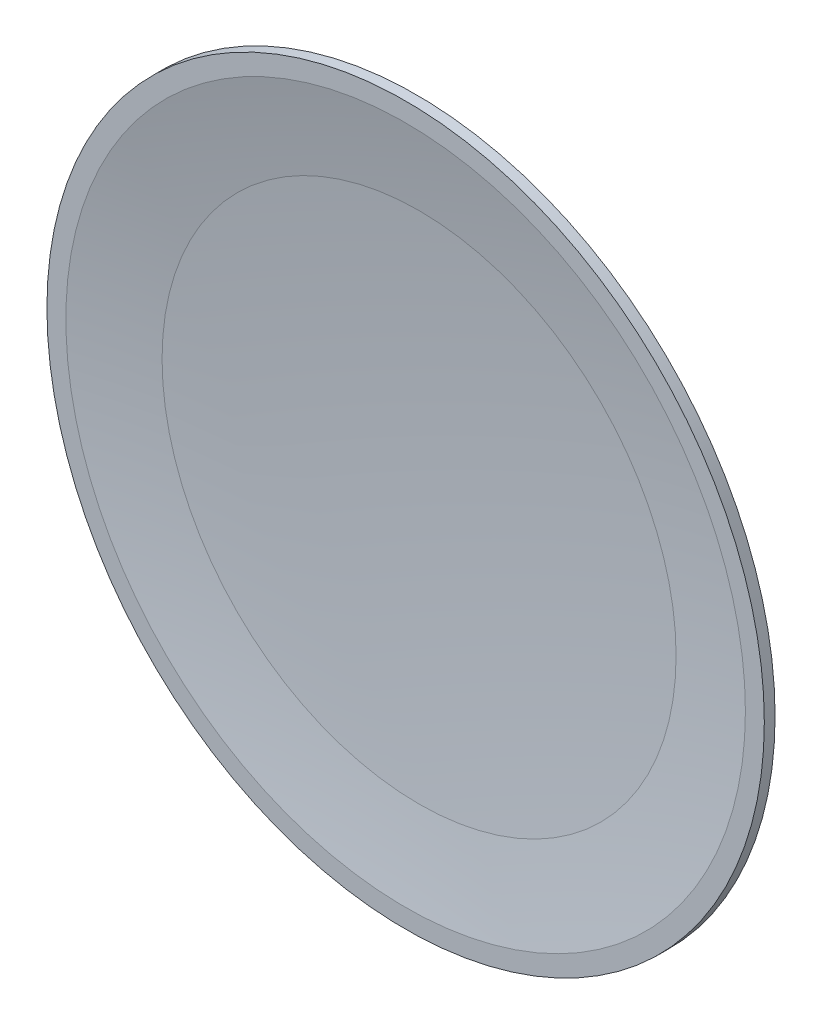
ISO-10303-21;
HEADER;
FILE_DESCRIPTION(('STEP AP214'),'2;1');
FILE_NAME('part.step','',(''),(''),'','','');
FILE_SCHEMA(('AUTOMOTIVE_DESIGN { 1 0 10303 214 1 1 1 1 }'));
ENDSEC;
DATA;
#1=APPLICATION_CONTEXT('core data for automotive mechanical design processes');
#2=APPLICATION_PROTOCOL_DEFINITION('international standard','automotive_design',2000,#1);
#3=PRODUCT_CONTEXT('',#1,'mechanical');
#4=PRODUCT('Part','Part','',(#3));
#5=PRODUCT_RELATED_PRODUCT_CATEGORY('part','',(#4));
#6=PRODUCT_DEFINITION_FORMATION('','',#4);
#7=PRODUCT_DEFINITION_CONTEXT('part definition',#1,'design');
#8=PRODUCT_DEFINITION('design','',#6,#7);
#9=PRODUCT_DEFINITION_SHAPE('','',#8);
#10=(LENGTH_UNIT() NAMED_UNIT(*) SI_UNIT(.MILLI.,.METRE.));
#11=(NAMED_UNIT(*) PLANE_ANGLE_UNIT() SI_UNIT($,.RADIAN.));
#12=(NAMED_UNIT(*) SI_UNIT($,.STERADIAN.) SOLID_ANGLE_UNIT());
#13=UNCERTAINTY_MEASURE_WITH_UNIT(LENGTH_MEASURE(1.E-05),#10,'distance_accuracy_value','');
#14=(GEOMETRIC_REPRESENTATION_CONTEXT(3) GLOBAL_UNCERTAINTY_ASSIGNED_CONTEXT((#13)) GLOBAL_UNIT_ASSIGNED_CONTEXT((#10,
#11,#12)) REPRESENTATION_CONTEXT('',''));
#15=CARTESIAN_POINT('',(0.,0.,0.));
#16=DIRECTION('',(0.,0.,1.));
#17=DIRECTION('',(1.,0.,0.));
#18=AXIS2_PLACEMENT_3D('',#15,#16,#17);
#19=CARTESIAN_POINT('',(0.,0.,0.));
#20=DIRECTION('',(0.,0.,-1.));
#21=DIRECTION('',(1.,0.,0.));
#22=AXIS2_PLACEMENT_3D('',#19,#20,#21);
#23=SPHERICAL_SURFACE('',#22,38.);
#24=CARTESIAN_POINT('',(0.,0.,-37.829089336118));
#25=DIRECTION('',(0.,0.,-1.));
#26=DIRECTION('',(-1.,0.,0.));
#27=AXIS2_PLACEMENT_3D('',#24,#25,#26);
#28=CIRCLE('',#27,3.6);
#29=CARTESIAN_POINT('',(3.60000000000005,0.,-37.829089336118));
#30=VERTEX_POINT('',#29);
#31=EDGE_CURVE('E10',#30,#30,#28,.T.);
#32=ORIENTED_EDGE('',*,*,#31,.T.);
#33=EDGE_LOOP('',(#32));
#34=FACE_BOUND('',#33,.T.);
#35=ADVANCED_FACE('F27',(#34),#23,.T.);
#36=CARTESIAN_POINT('',(0.,0.,-12.));
#37=DIRECTION('',(0.,0.,-1.));
#38=DIRECTION('',(1.,0.,0.));
#39=AXIS2_PLACEMENT_3D('',#36,#37,#38);
#40=SPHERICAL_SURFACE('',#39,26.0787625460482);
#41=CARTESIAN_POINT('',(0.,0.,-37.6425302170665));
#42=DIRECTION('',(0.,0.,-1.));
#43=DIRECTION('',(-1.,0.,0.));
#44=AXIS2_PLACEMENT_3D('',#41,#42,#43);
#45=CIRCLE('',#44,4.75);
#46=CARTESIAN_POINT('',(4.75000000000004,0.,-37.6425302170665));
#47=VERTEX_POINT('',#46);
#48=EDGE_CURVE('E33',#47,#47,#45,.T.);
#49=CARTESIAN_POINT('',(3.60000000000005,0.,-37.829089336118));
#50=CARTESIAN_POINT('',(3.61202058531943,0.,-37.8274139341543));
#51=CARTESIAN_POINT('',(3.62404000106563,0.,-37.8257301407989));
#52=CARTESIAN_POINT('',(3.64807646998601,0.,-37.8223457746128));
#53=CARTESIAN_POINT('',(3.66009352316019,0.,-37.820645201782));
#54=CARTESIAN_POINT('',(3.68412524351089,0.,-37.8172272799532));
#55=CARTESIAN_POINT('',(3.69613991068741,0.,-37.8155099309551));
#56=CARTESIAN_POINT('',(3.72016683562303,0.,-37.812058460141));
#57=CARTESIAN_POINT('',(3.73217909338213,0.,-37.810324338325));
#58=CARTESIAN_POINT('',(3.75620117606751,0.,-37.8068393252549));
#59=CARTESIAN_POINT('',(3.7682110009938,0.,-37.8050884340008));
#60=CARTESIAN_POINT('',(3.79222819460301,0.,-37.8015698854676));
#61=CARTESIAN_POINT('',(3.80423556328593,0.,-37.7998022281885));
#62=CARTESIAN_POINT('',(3.82824782100259,0.,-37.796250151051));
#63=CARTESIAN_POINT('',(3.84025271003634,0.,-37.7944657311926));
#64=CARTESIAN_POINT('',(3.86425998505372,0.,-37.7908801323748));
#65=CARTESIAN_POINT('',(3.87626237103734,0.,-37.7890789534153));
#66=CARTESIAN_POINT('',(3.90026461655839,0.,-37.7854598399065));
#67=CARTESIAN_POINT('',(3.91226447609581,0.,-37.7836419053571));
#68=CARTESIAN_POINT('',(3.9362616453333,0.,-37.779989284212));
#69=CARTESIAN_POINT('',(3.94825895503337,0.,-37.7781545976163));
#70=CARTESIAN_POINT('',(3.97225100120996,0.,-37.774468475955));
#71=CARTESIAN_POINT('',(3.98424573768649,0.,-37.7726170408893));
#72=CARTESIAN_POINT('',(4.00823261403484,0.,-37.7688974258969));
#73=CARTESIAN_POINT('',(4.02022475390666,0.,-37.7670292459702));
#74=CARTESIAN_POINT('',(4.04420641366949,0.,-37.7632761448975));
#75=CARTESIAN_POINT('',(4.0561959335605,0.,-37.7613912237514));
#76=CARTESIAN_POINT('',(4.0801723299907,0.,-37.7576046439142));
#77=CARTESIAN_POINT('',(4.0921592065299,0.,-37.755702985223));
#78=CARTESIAN_POINT('',(4.11613029289063,0.,-37.7518829340023));
#79=CARTESIAN_POINT('',(4.12811450271217,0.,-37.7499645414728));
#80=CARTESIAN_POINT('',(4.15208023227695,0.,-37.7461110263151));
#81=CARTESIAN_POINT('',(4.16406175202018,0.,-37.7441759036869));
#82=CARTESIAN_POINT('',(4.18802207807293,0.,-37.7402889321038));
#83=CARTESIAN_POINT('',(4.20000088438245,0.,-37.7383370831489));
#84=CARTESIAN_POINT('',(4.22395576021767,0.,-37.7344166627172));
#85=CARTESIAN_POINT('',(4.23593182974337,0.,-37.7324480912403));
#86=CARTESIAN_POINT('',(4.25988120866616,0.,-37.728494229602));
#87=CARTESIAN_POINT('',(4.27185451806325,0.,-37.7265089394405));
#88=CARTESIAN_POINT('',(4.29579835338943,0.,-37.7225216443028));
#89=CARTESIAN_POINT('',(4.30776887931852,0.,-37.7205196393266));
#90=CARTESIAN_POINT('',(4.33170712437472,0.,-37.7164989184619));
#91=CARTESIAN_POINT('',(4.34367484350182,0.,-37.7144802025734));
#92=CARTESIAN_POINT('',(4.36760745162556,0.,-37.7104260638192));
#93=CARTESIAN_POINT('',(4.37957234062219,0.,-37.7083906409535));
#94=CARTESIAN_POINT('',(4.40349926516197,0.,-37.7043030922126));
#95=CARTESIAN_POINT('',(4.41546130070513,0.,-37.7022509663373));
#96=CARTESIAN_POINT('',(4.43938249502055,0.,-37.6981300155773));
#97=CARTESIAN_POINT('',(4.45134165379281,0.,-37.6960611906926));
#98=CARTESIAN_POINT('',(4.47525707125464,0.,-37.6919068459466));
#99=CARTESIAN_POINT('',(4.48721332994419,0.,-37.6898213260852));
#100=CARTESIAN_POINT('',(4.51112292393444,0.,-37.6856335954511));
#101=CARTESIAN_POINT('',(4.52307625923512,0.,-37.6835313846783));
#102=CARTESIAN_POINT('',(4.54697998314715,0.,-37.6793102763191));
#103=CARTESIAN_POINT('',(4.5589303717585,0.,-37.6771913787328));
#104=CARTESIAN_POINT('',(4.58282817899714,0.,-37.6729369008768));
#105=CARTESIAN_POINT('',(4.59477559762444,0.,-37.6708013206072));
#106=CARTESIAN_POINT('',(4.61866744160602,0.,-37.6665134815475));
#107=CARTESIAN_POINT('',(4.63061186696031,0.,-37.6643612227573));
#108=CARTESIAN_POINT('',(4.65449770111287,0.,-37.6600400308525));
#109=CARTESIAN_POINT('',(4.66643910991114,0.,-37.6578710977377));
#110=CARTESIAN_POINT('',(4.69031888767412,0.,-37.6535165614096));
#111=CARTESIAN_POINT('',(4.70225725663883,0.,-37.6513309581962));
#112=CARTESIAN_POINT('',(4.72613093146464,0.,-37.6469430859381));
#113=CARTESIAN_POINT('',(4.73806623732575,0.,-37.6447408168933));
#114=CARTESIAN_POINT('',(4.75000000000004,0.,-37.6425302170665));
#115=B_SPLINE_CURVE_WITH_KNOTS('',3,(#49,#50,#51,#52,#53,#54,#55,#56,#57,#58,#59,#60,#61,#62,
#63,#64,#65,#66,#67,#68,#69,#70,#71,#72,#73,#74,#75,#76,#77,#78,#79,#80,#81,#82,#83,#84,#85,#86,
#87,#88,#89,#90,#91,#92,#93,#94,#95,#96,#97,#98,#99,#100,#101,#102,#103,#104,#105,#106,#107,
#108,#109,#110,#111,#112,#113,#114),.UNSPECIFIED.,.F.,.F.,(4,2,2,2,2,2,2,2,2,2,2,2,2,2,2,2,2,2,
2,2,2,2,2,2,2,2,2,2,2,2,2,2,4),(0.,0.0364103388214898,0.0728206776429851,0.109231016464475,
0.145641355285971,0.18205169410746,0.218462032928955,0.254872371750445,0.291282710571941,
0.327693049393431,0.36410338821492,0.400513727036416,0.436924065857905,0.473334404679401,
0.509744743500891,0.546155082322385,0.582565421143876,0.618975759965365,0.655386098786861,
0.691796437608351,0.728206776429847,0.764617115251334,0.801027454072832,0.83743779289432,
0.873848131715812,0.910258470537305,0.946668809358796,0.983079148180292,1.01948948700178,
1.05589982582328,1.09231016464477,1.12872050346626,1.16513084228775),.UNSPECIFIED.);
#116=EDGE_CURVE('BSEAM65',#30,#47,#115,.T.);
#117=ORIENTED_EDGE('',*,*,#31,.F.);
#118=ORIENTED_EDGE('',*,*,#48,.T.);
#119=ORIENTED_EDGE('',*,*,#116,.T.);
#120=ORIENTED_EDGE('',*,*,#116,.F.);
#121=EDGE_LOOP('',(#117,#119,#118,#120));
#122=FACE_BOUND('',#121,.T.);
#123=ADVANCED_FACE('F65',(#122),#40,.T.);
#124=CARTESIAN_POINT('',(4.75,0.,-37.6425302170665));
#125=DIRECTION('',(0.,0.,1.));
#126=DIRECTION('',(1.,0.,0.));
#127=AXIS2_PLACEMENT_3D('',#124,#125,#126);
#128=PLANE('',#127);
#129=ORIENTED_EDGE('',*,*,#48,.F.);
#130=EDGE_LOOP('',(#129));
#131=FACE_BOUND('',#130,.T.);
#132=CARTESIAN_POINT('',(0.,0.,-37.6425302170665));
#133=DIRECTION('',(0.,0.,-1.));
#134=DIRECTION('',(-1.,0.,0.));
#135=AXIS2_PLACEMENT_3D('',#132,#133,#134);
#136=CIRCLE('',#135,5.);
#137=CARTESIAN_POINT('',(-5.,0.,-37.6425302170665));
#138=VERTEX_POINT('',#137);
#139=EDGE_CURVE('E37',#138,#138,#136,.T.);
#140=ORIENTED_EDGE('',*,*,#139,.T.);
#141=EDGE_LOOP('',(#140));
#142=FACE_BOUND('',#141,.T.);
#143=ADVANCED_FACE('F69',(#131,#142),#128,.F.);
#144=CARTESIAN_POINT('',(0.,0.,-22.1284260553821));
#145=DIRECTION('',(0.,0.,-1.));
#146=DIRECTION('',(-1.,0.,0.));
#147=AXIS2_PLACEMENT_3D('',#144,#145,#146);
#148=CYLINDRICAL_SURFACE('',#147,5.);
#149=ORIENTED_EDGE('',*,*,#139,.F.);
#150=EDGE_LOOP('',(#149));
#151=FACE_BOUND('',#150,.T.);
#152=CARTESIAN_POINT('',(0.,0.,-37.4925302170665));
#153=DIRECTION('',(0.,0.,-1.));
#154=DIRECTION('',(-1.,0.,0.));
#155=AXIS2_PLACEMENT_3D('',#152,#153,#154);
#156=CIRCLE('',#155,5.);
#157=CARTESIAN_POINT('',(-5.,0.,-37.4925302170665));
#158=VERTEX_POINT('',#157);
#159=EDGE_CURVE('E41',#158,#158,#156,.T.);
#160=ORIENTED_EDGE('',*,*,#159,.T.);
#161=EDGE_LOOP('',(#160));
#162=FACE_BOUND('',#161,.T.);
#163=ADVANCED_FACE('F74',(#151,#162),#148,.T.);
#164=CARTESIAN_POINT('',(4.73620420815078,0.,-37.4925302170665));
#165=DIRECTION('',(0.,0.,-1.));
#166=DIRECTION('',(-1.,0.,0.));
#167=AXIS2_PLACEMENT_3D('',#164,#165,#166);
#168=PLANE('',#167);
#169=ORIENTED_EDGE('',*,*,#159,.F.);
#170=EDGE_LOOP('',(#169));
#171=FACE_BOUND('',#170,.T.);
#172=CARTESIAN_POINT('',(0.,0.,-37.4925302170665));
#173=DIRECTION('',(0.,0.,-1.));
#174=DIRECTION('',(-1.,0.,0.));
#175=AXIS2_PLACEMENT_3D('',#172,#173,#174);
#176=CIRCLE('',#175,4.73620420815078);
#177=CARTESIAN_POINT('',(4.73620420815084,0.,-37.4925302170665));
#178=VERTEX_POINT('',#177);
#179=EDGE_CURVE('E46',#178,#178,#176,.T.);
#180=ORIENTED_EDGE('',*,*,#179,.T.);
#181=EDGE_LOOP('',(#180));
#182=FACE_BOUND('',#181,.T.);
#183=ADVANCED_FACE('F61',(#171,#182),#168,.F.);
#184=CARTESIAN_POINT('',(0.,0.,-12.));
#185=DIRECTION('',(0.,0.,-1.));
#186=DIRECTION('',(1.,0.,0.));
#187=AXIS2_PLACEMENT_3D('',#184,#185,#186);
#188=SPHERICAL_SURFACE('',#187,25.9287625460482);
#189=CARTESIAN_POINT('',(0.,0.,-37.6800738679437));
#190=DIRECTION('',(0.,0.,-1.));
#191=DIRECTION('',(-1.,0.,0.));
#192=AXIS2_PLACEMENT_3D('',#189,#190,#191);
#193=CIRCLE('',#192,3.58253168950533);
#194=CARTESIAN_POINT('',(3.58253168950537,0.,-37.6800738679437));
#195=VERTEX_POINT('',#194);
#196=EDGE_CURVE('E49',#195,#195,#193,.T.);
#197=CARTESIAN_POINT('',(4.73620420815084,0.,-37.4925302170665));
#198=CARTESIAN_POINT('',(4.72423285693938,0.,-37.4947543495343));
#199=CARTESIAN_POINT('',(4.71225993903912,0.,-37.496970049329));
#200=CARTESIAN_POINT('',(4.68831099362892,0.,-37.5013845792008));
#201=CARTESIAN_POINT('',(4.67633496611899,0.,-37.503583409278));
#202=CARTESIAN_POINT('',(4.65237982525742,0.,-37.5079641953435));
#203=CARTESIAN_POINT('',(4.64040071190578,0.,-37.510146151332));
#204=CARTESIAN_POINT('',(4.61643942313655,0.,-37.5144931848914));
#205=CARTESIAN_POINT('',(4.60445724771894,0.,-37.5166582624625));
#206=CARTESIAN_POINT('',(4.58048985859914,0.,-37.5209715348895));
#207=CARTESIAN_POINT('',(4.56850464489693,0.,-37.5231197297455));
#208=CARTESIAN_POINT('',(4.54453120299544,0.,-37.527399232479));
#209=CARTESIAN_POINT('',(4.53254297479616,0.,-37.5295305403565));
#210=CARTESIAN_POINT('',(4.50856352769398,0.,-37.5337762649028));
#211=CARTESIAN_POINT('',(4.49657230879108,0.,-37.5358906815717));
#212=CARTESIAN_POINT('',(4.47258690408109,0.,-37.5401026195043));
#213=CARTESIAN_POINT('',(4.460592718274,0.,-37.542200140768));
#214=CARTESIAN_POINT('',(4.43660140356091,0.,-37.5463782837272));
#215=CARTESIAN_POINT('',(4.42460427465492,0.,-37.5484589054227));
#216=CARTESIAN_POINT('',(4.40060709755518,0.,-37.552603245116));
#217=CARTESIAN_POINT('',(4.38860704936144,0.,-37.5546669631139));
#218=CARTESIAN_POINT('',(4.36460405750312,0.,-37.5587774913159));
#219=CARTESIAN_POINT('',(4.35260111383855,0.,-37.5608243015201));
#220=CARTESIAN_POINT('',(4.32859235486128,0.,-37.5649010100725));
#221=CARTESIAN_POINT('',(4.31658653954857,0.,-37.5669309084207));
#222=CARTESIAN_POINT('',(4.29257206110341,0.,-37.5709737892322));
#223=CARTESIAN_POINT('',(4.28056339797095,0.,-37.5729867716956));
#224=CARTESIAN_POINT('',(4.25654324772031,0.,-37.5769958167423));
#225=CARTESIAN_POINT('',(4.24453176060212,0.,-37.5789918793257));
#226=CARTESIAN_POINT('',(4.22050598621968,0.,-37.5829670806506));
#227=CARTESIAN_POINT('',(4.20849169895541,0.,-37.5849462193922));
#228=CARTESIAN_POINT('',(4.184460348126,0.,-37.5888875691056));
#229=CARTESIAN_POINT('',(4.17244328456086,0.,-37.5908497800775));
#230=CARTESIAN_POINT('',(4.14840640498038,0.,-37.5947572703569));
#231=CARTESIAN_POINT('',(4.13638658896505,0.,-37.5967025496644));
#232=CARTESIAN_POINT('',(4.11234422834039,0.,-37.6005761727545));
#233=CARTESIAN_POINT('',(4.10032168373105,0.,-37.6025045165369));
#234=CARTESIAN_POINT('',(4.07627388977996,0.,-37.6063442647494));
#235=CARTESIAN_POINT('',(4.0642486404382,0.,-37.6082556691795));
#236=CARTESIAN_POINT('',(4.04019546088921,0.,-37.6120615348936));
#237=CARTESIAN_POINT('',(4.02816753068198,0.,-37.6139559961777));
#238=CARTESIAN_POINT('',(4.00410901327432,0.,-37.6177279718398));
#239=CARTESIAN_POINT('',(3.9920784260739,0.,-37.6196054862178));
#240=CARTESIAN_POINT('',(3.9680146185574,0.,-37.6233435643415));
#241=CARTESIAN_POINT('',(3.95598139824132,0.,-37.6252041280872));
#242=CARTESIAN_POINT('',(3.9319123483763,0.,-37.6289083012534));
#243=CARTESIAN_POINT('',(3.91987651882736,0.,-37.6307519106739));
#244=CARTESIAN_POINT('',(3.89580227438454,0.,-37.6344221715308));
#245=CARTESIAN_POINT('',(3.88376385949067,0.,-37.6362488229671));
#246=CARTESIAN_POINT('',(3.8596844682511,0.,-37.6398851642301));
#247=CARTESIAN_POINT('',(3.84764349190539,0.,-37.6416948540569));
#248=CARTESIAN_POINT('',(3.82355900166031,0.,-37.6452972685089));
#249=CARTESIAN_POINT('',(3.81151548776093,0.,-37.6470899931342));
#250=CARTESIAN_POINT('',(3.7874259463117,0.,-37.6506584736254));
#251=CARTESIAN_POINT('',(3.77537991876186,0.,-37.6524342294913));
#252=CARTESIAN_POINT('',(3.75128537391989,0.,-37.6559687689392));
#253=CARTESIAN_POINT('',(3.73923685662778,0.,-37.6577275525212));
#254=CARTESIAN_POINT('',(3.71513735621439,0.,-37.6612281439105));
#255=CARTESIAN_POINT('',(3.70308637309312,0.,-37.6629699517179));
#256=CARTESIAN_POINT('',(3.67898196493953,0.,-37.6664365881013));
#257=CARTESIAN_POINT('',(3.6669285399072,0.,-37.6681614166774));
#258=CARTESIAN_POINT('',(3.6428192718541,0.,-37.6715940911731));
#259=CARTESIAN_POINT('',(3.63076342883332,0.,-37.6733019370927));
#260=CARTESIAN_POINT('',(3.606649348732,0.,-37.676700642893));
#261=CARTESIAN_POINT('',(3.59459111165146,0.,-37.6783915027737));
#262=CARTESIAN_POINT('',(3.58253168950537,0.,-37.6800738679437));
#263=B_SPLINE_CURVE_WITH_KNOTS('',3,(#197,#198,#199,#200,#201,#202,#203,#204,#205,#206,#207,
#208,#209,#210,#211,#212,#213,#214,#215,#216,#217,#218,#219,#220,#221,#222,#223,#224,#225,#226,
#227,#228,#229,#230,#231,#232,#233,#234,#235,#236,#237,#238,#239,#240,#241,#242,#243,#244,#245,
#246,#247,#248,#249,#250,#251,#252,#253,#254,#255,#256,#257,#258,#259,#260,#261,#262),
.UNSPECIFIED.,.F.,.F.,(4,2,2,2,2,2,2,2,2,2,2,2,2,2,2,2,2,2,2,2,2,2,2,2,2,2,2,2,2,2,2,2,4),(0.,
0.0365286177519679,0.0730572355039379,0.109585853255913,0.14611447100788,0.182643088759848,
0.219171706511824,0.255700324263792,0.292228942015761,0.32875755976773,0.365286177519698,
0.401814795271673,0.438343413023641,0.474872030775611,0.511400648527585,0.547929266279553,
0.584457884031521,0.620986501783491,0.65751511953546,0.694043737287434,0.730572355039403,
0.767100972791372,0.803629590543346,0.840158208295314,0.876686826047283,0.913215443799252,
0.94974406155122,0.986272679303195,1.02280129705516,1.05932991480713,1.09585853255911,
1.13238715031107,1.16891576806305),.UNSPECIFIED.);
#264=EDGE_CURVE('BSEAM53',#178,#195,#263,.T.);
#265=ORIENTED_EDGE('',*,*,#179,.F.);
#266=ORIENTED_EDGE('',*,*,#196,.T.);
#267=ORIENTED_EDGE('',*,*,#264,.T.);
#268=ORIENTED_EDGE('',*,*,#264,.F.);
#269=EDGE_LOOP('',(#265,#267,#266,#268));
#270=FACE_BOUND('',#269,.T.);
#271=ADVANCED_FACE('F53',(#270),#188,.F.);
#272=CARTESIAN_POINT('',(0.,0.,0.));
#273=DIRECTION('',(0.,0.,-1.));
#274=DIRECTION('',(-1.,0.,0.));
#275=AXIS2_PLACEMENT_3D('',#272,#273,#274);
#276=SPHERICAL_SURFACE('',#275,37.85);
#277=ORIENTED_EDGE('',*,*,#196,.F.);
#278=EDGE_LOOP('',(#277));
#279=FACE_BOUND('',#278,.T.);
#280=ADVANCED_FACE('F55',(#279),#276,.F.);
#281=CLOSED_SHELL('',(#35,#123,#143,#163,#183,#271,#280));
#282=MANIFOLD_SOLID_BREP('B2',#281);
#283=ADVANCED_BREP_SHAPE_REPRESENTATION('',(#18,#282),#14);
#284=SHAPE_DEFINITION_REPRESENTATION(#9,#283);
ENDSEC;
END-ISO-10303-21;
